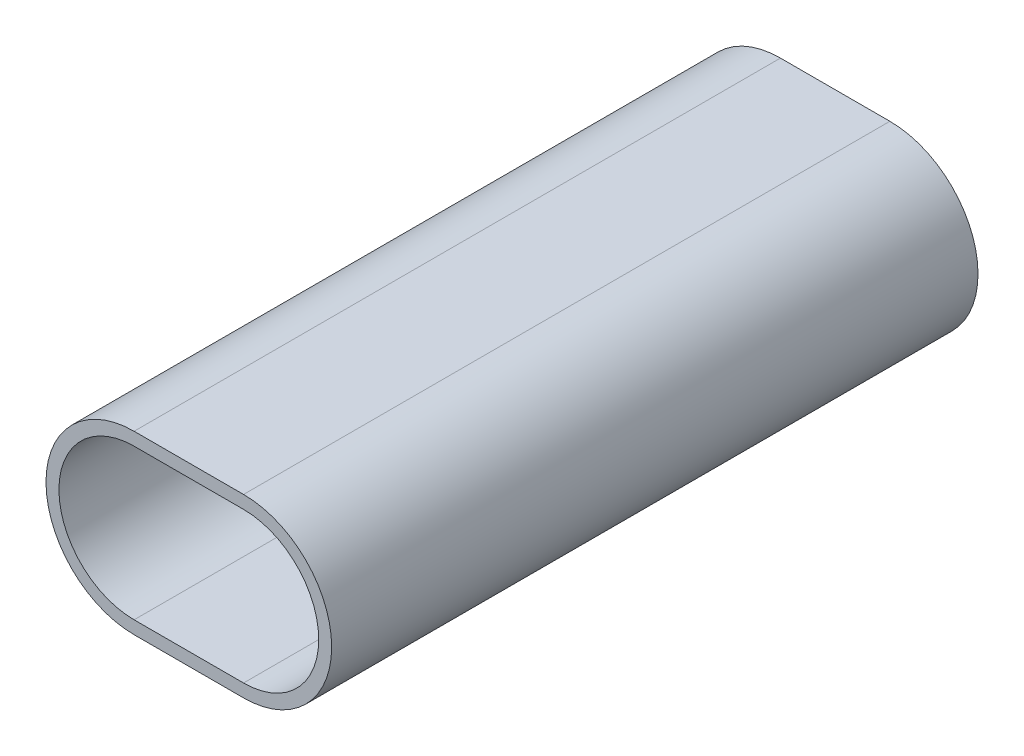
ISO-10303-21;
HEADER;
FILE_DESCRIPTION(('STEP AP214'),'2;1');
FILE_NAME('part.step','',(''),(''),'','','');
FILE_SCHEMA(('AUTOMOTIVE_DESIGN { 1 0 10303 214 1 1 1 1 }'));
ENDSEC;
DATA;
#1=APPLICATION_CONTEXT('core data for automotive mechanical design processes');
#2=APPLICATION_PROTOCOL_DEFINITION('international standard','automotive_design',2000,#1);
#3=PRODUCT_CONTEXT('',#1,'mechanical');
#4=PRODUCT('Part','Part','',(#3));
#5=PRODUCT_RELATED_PRODUCT_CATEGORY('part','',(#4));
#6=PRODUCT_DEFINITION_FORMATION('','',#4);
#7=PRODUCT_DEFINITION_CONTEXT('part definition',#1,'design');
#8=PRODUCT_DEFINITION('design','',#6,#7);
#9=PRODUCT_DEFINITION_SHAPE('','',#8);
#10=(LENGTH_UNIT() NAMED_UNIT(*) SI_UNIT(.MILLI.,.METRE.));
#11=(NAMED_UNIT(*) PLANE_ANGLE_UNIT() SI_UNIT($,.RADIAN.));
#12=(NAMED_UNIT(*) SI_UNIT($,.STERADIAN.) SOLID_ANGLE_UNIT());
#13=UNCERTAINTY_MEASURE_WITH_UNIT(LENGTH_MEASURE(1.E-05),#10,'distance_accuracy_value','');
#14=(GEOMETRIC_REPRESENTATION_CONTEXT(3) GLOBAL_UNCERTAINTY_ASSIGNED_CONTEXT((#13)) GLOBAL_UNIT_ASSIGNED_CONTEXT((#10,
#11,#12)) REPRESENTATION_CONTEXT('',''));
#15=CARTESIAN_POINT('',(0.,0.,0.));
#16=DIRECTION('',(0.,0.,1.));
#17=DIRECTION('',(1.,0.,0.));
#18=AXIS2_PLACEMENT_3D('',#15,#16,#17);
#19=CARTESIAN_POINT('',(-12.7,0.,75.));
#20=DIRECTION('',(0.,0.,1.));
#21=DIRECTION('',(1.,0.,0.));
#22=AXIS2_PLACEMENT_3D('',#19,#20,#21);
#23=PLANE('',#22);
#24=CARTESIAN_POINT('',(-12.7,0.,75.));
#25=DIRECTION('',(0.,0.,1.));
#26=DIRECTION('',(1.,0.,0.));
#27=AXIS2_PLACEMENT_3D('',#24,#25,#26);
#28=CIRCLE('',#27,20.447);
#29=CARTESIAN_POINT('',(-12.7,20.447,75.));
#30=VERTEX_POINT('',#29);
#31=CARTESIAN_POINT('',(-12.7,-20.447,75.));
#32=VERTEX_POINT('',#31);
#33=EDGE_CURVE('E159',#30,#32,#28,.T.);
#34=ORIENTED_EDGE('',*,*,#33,.T.);
#35=DIRECTION('',(1.,0.,0.));
#36=VECTOR('',#35,1.);
#37=CARTESIAN_POINT('',(-12.7,-20.447,75.));
#38=LINE('',#37,#36);
#39=CARTESIAN_POINT('',(12.7,-20.447,75.));
#40=VERTEX_POINT('',#39);
#41=EDGE_CURVE('E163',#32,#40,#38,.T.);
#42=ORIENTED_EDGE('',*,*,#41,.T.);
#43=CARTESIAN_POINT('',(12.7,0.,75.));
#44=DIRECTION('',(0.,0.,1.));
#45=DIRECTION('',(1.,0.,0.));
#46=AXIS2_PLACEMENT_3D('',#43,#44,#45);
#47=CIRCLE('',#46,20.447);
#48=CARTESIAN_POINT('',(12.7,20.447,75.));
#49=VERTEX_POINT('',#48);
#50=EDGE_CURVE('E167',#40,#49,#47,.T.);
#51=ORIENTED_EDGE('',*,*,#50,.T.);
#52=DIRECTION('',(-1.,0.,0.));
#53=VECTOR('',#52,1.);
#54=CARTESIAN_POINT('',(-12.7,20.447,75.));
#55=LINE('',#54,#53);
#56=EDGE_CURVE('E170',#49,#30,#55,.T.);
#57=ORIENTED_EDGE('',*,*,#56,.T.);
#58=EDGE_LOOP('',(#34,#42,#51,#57));
#59=FACE_BOUND('',#58,.T.);
#60=DIRECTION('',(1.,0.,0.));
#61=VECTOR('',#60,1.);
#62=CARTESIAN_POINT('',(-12.7,-17.447,75.));
#63=LINE('',#62,#61);
#64=CARTESIAN_POINT('',(-12.7,-17.447,75.));
#65=VERTEX_POINT('',#64);
#66=CARTESIAN_POINT('',(12.7,-17.447,75.));
#67=VERTEX_POINT('',#66);
#68=EDGE_CURVE('E120',#65,#67,#63,.T.);
#69=ORIENTED_EDGE('',*,*,#68,.F.);
#70=CARTESIAN_POINT('',(-12.7,0.,75.));
#71=DIRECTION('',(0.,0.,1.));
#72=DIRECTION('',(1.,0.,0.));
#73=AXIS2_PLACEMENT_3D('',#70,#71,#72);
#74=CIRCLE('',#73,17.447);
#75=CARTESIAN_POINT('',(-12.7,17.447,75.));
#76=VERTEX_POINT('',#75);
#77=EDGE_CURVE('E111',#76,#65,#74,.T.);
#78=ORIENTED_EDGE('',*,*,#77,.F.);
#79=DIRECTION('',(-1.,0.,0.));
#80=VECTOR('',#79,1.);
#81=CARTESIAN_POINT('',(-12.7,17.447,75.));
#82=LINE('',#81,#80);
#83=CARTESIAN_POINT('',(12.7,17.447,75.));
#84=VERTEX_POINT('',#83);
#85=EDGE_CURVE('E137',#84,#76,#82,.T.);
#86=ORIENTED_EDGE('',*,*,#85,.F.);
#87=CARTESIAN_POINT('',(12.7,0.,75.));
#88=DIRECTION('',(0.,0.,1.));
#89=DIRECTION('',(1.,0.,0.));
#90=AXIS2_PLACEMENT_3D('',#87,#88,#89);
#91=CIRCLE('',#90,17.447);
#92=EDGE_CURVE('E133',#67,#84,#91,.T.);
#93=ORIENTED_EDGE('',*,*,#92,.F.);
#94=EDGE_LOOP('',(#69,#78,#86,#93));
#95=FACE_BOUND('',#94,.T.);
#96=ADVANCED_FACE('F45',(#59,#95),#23,.T.);
#97=CARTESIAN_POINT('',(-12.7,0.,-75.));
#98=DIRECTION('',(0.,0.,1.));
#99=DIRECTION('',(1.,0.,0.));
#100=AXIS2_PLACEMENT_3D('',#97,#98,#99);
#101=PLANE('',#100);
#102=CARTESIAN_POINT('',(-12.7,0.,-75.));
#103=DIRECTION('',(0.,0.,1.));
#104=DIRECTION('',(1.,0.,0.));
#105=AXIS2_PLACEMENT_3D('',#102,#103,#104);
#106=CIRCLE('',#105,20.447);
#107=CARTESIAN_POINT('',(-12.7,20.447,-75.));
#108=VERTEX_POINT('',#107);
#109=CARTESIAN_POINT('',(-12.7,-20.447,-75.));
#110=VERTEX_POINT('',#109);
#111=EDGE_CURVE('E129',#108,#110,#106,.T.);
#112=ORIENTED_EDGE('',*,*,#111,.F.);
#113=DIRECTION('',(-1.,0.,0.));
#114=VECTOR('',#113,1.);
#115=CARTESIAN_POINT('',(-12.7,20.447,-75.));
#116=LINE('',#115,#114);
#117=CARTESIAN_POINT('',(12.7,20.447,-75.));
#118=VERTEX_POINT('',#117);
#119=EDGE_CURVE('E164',#118,#108,#116,.T.);
#120=ORIENTED_EDGE('',*,*,#119,.F.);
#121=CARTESIAN_POINT('',(12.7,0.,-75.));
#122=DIRECTION('',(0.,0.,1.));
#123=DIRECTION('',(1.,0.,0.));
#124=AXIS2_PLACEMENT_3D('',#121,#122,#123);
#125=CIRCLE('',#124,20.447);
#126=CARTESIAN_POINT('',(12.7,-20.447,-75.));
#127=VERTEX_POINT('',#126);
#128=EDGE_CURVE('E180',#127,#118,#125,.T.);
#129=ORIENTED_EDGE('',*,*,#128,.F.);
#130=DIRECTION('',(1.,0.,0.));
#131=VECTOR('',#130,1.);
#132=CARTESIAN_POINT('',(-12.7,-20.447,-75.));
#133=LINE('',#132,#131);
#134=EDGE_CURVE('E177',#110,#127,#133,.T.);
#135=ORIENTED_EDGE('',*,*,#134,.F.);
#136=EDGE_LOOP('',(#112,#120,#129,#135));
#137=FACE_BOUND('',#136,.T.);
#138=CARTESIAN_POINT('',(-12.7,0.,-75.));
#139=DIRECTION('',(0.,0.,1.));
#140=DIRECTION('',(1.,0.,0.));
#141=AXIS2_PLACEMENT_3D('',#138,#139,#140);
#142=CIRCLE('',#141,17.447);
#143=CARTESIAN_POINT('',(-12.7,17.447,-75.));
#144=VERTEX_POINT('',#143);
#145=CARTESIAN_POINT('',(-12.7,-17.447,-75.));
#146=VERTEX_POINT('',#145);
#147=EDGE_CURVE('E69',#144,#146,#142,.T.);
#148=ORIENTED_EDGE('',*,*,#147,.T.);
#149=DIRECTION('',(1.,0.,0.));
#150=VECTOR('',#149,1.);
#151=CARTESIAN_POINT('',(-12.7,-17.447,-75.));
#152=LINE('',#151,#150);
#153=CARTESIAN_POINT('',(12.7,-17.447,-75.));
#154=VERTEX_POINT('',#153);
#155=EDGE_CURVE('E127',#146,#154,#152,.T.);
#156=ORIENTED_EDGE('',*,*,#155,.T.);
#157=CARTESIAN_POINT('',(12.7,0.,-75.));
#158=DIRECTION('',(0.,0.,1.));
#159=DIRECTION('',(1.,0.,0.));
#160=AXIS2_PLACEMENT_3D('',#157,#158,#159);
#161=CIRCLE('',#160,17.447);
#162=CARTESIAN_POINT('',(12.7,17.447,-75.));
#163=VERTEX_POINT('',#162);
#164=EDGE_CURVE('E146',#154,#163,#161,.T.);
#165=ORIENTED_EDGE('',*,*,#164,.T.);
#166=DIRECTION('',(-1.,0.,0.));
#167=VECTOR('',#166,1.);
#168=CARTESIAN_POINT('',(-12.7,17.447,-75.));
#169=LINE('',#168,#167);
#170=EDGE_CURVE('E121',#163,#144,#169,.T.);
#171=ORIENTED_EDGE('',*,*,#170,.T.);
#172=EDGE_LOOP('',(#148,#156,#165,#171));
#173=FACE_BOUND('',#172,.T.);
#174=ADVANCED_FACE('F203',(#137,#173),#101,.F.);
#175=CARTESIAN_POINT('',(-12.7,0.,75.));
#176=DIRECTION('',(0.,0.,-1.));
#177=DIRECTION('',(-1.,0.,0.));
#178=AXIS2_PLACEMENT_3D('',#175,#176,#177);
#179=CYLINDRICAL_SURFACE('',#178,20.447);
#180=ORIENTED_EDGE('',*,*,#111,.T.);
#181=DIRECTION('',(0.,0.,-1.));
#182=VECTOR('',#181,1.);
#183=CARTESIAN_POINT('',(-12.7,-20.447,75.));
#184=LINE('',#183,#182);
#185=EDGE_CURVE('E11',#32,#110,#184,.T.);
#186=ORIENTED_EDGE('',*,*,#185,.F.);
#187=ORIENTED_EDGE('',*,*,#33,.F.);
#188=DIRECTION('',(0.,0.,-1.));
#189=VECTOR('',#188,1.);
#190=CARTESIAN_POINT('',(-12.7,20.447,75.));
#191=LINE('',#190,#189);
#192=EDGE_CURVE('E173',#30,#108,#191,.T.);
#193=ORIENTED_EDGE('',*,*,#192,.T.);
#194=EDGE_LOOP('',(#180,#186,#187,#193));
#195=FACE_BOUND('',#194,.T.);
#196=ADVANCED_FACE('F47',(#195),#179,.T.);
#197=CARTESIAN_POINT('',(-12.7,-20.447,75.));
#198=DIRECTION('',(0.,1.,0.));
#199=DIRECTION('',(-1.,0.,0.));
#200=AXIS2_PLACEMENT_3D('',#197,#198,#199);
#201=PLANE('',#200);
#202=ORIENTED_EDGE('',*,*,#134,.T.);
#203=DIRECTION('',(0.,0.,-1.));
#204=VECTOR('',#203,1.);
#205=CARTESIAN_POINT('',(12.7,-20.447,75.));
#206=LINE('',#205,#204);
#207=EDGE_CURVE('E54',#40,#127,#206,.T.);
#208=ORIENTED_EDGE('',*,*,#207,.F.);
#209=ORIENTED_EDGE('',*,*,#41,.F.);
#210=ORIENTED_EDGE('',*,*,#185,.T.);
#211=EDGE_LOOP('',(#202,#208,#209,#210));
#212=FACE_BOUND('',#211,.T.);
#213=ADVANCED_FACE('F213',(#212),#201,.F.);
#214=CARTESIAN_POINT('',(12.7,0.,75.));
#215=DIRECTION('',(0.,0.,-1.));
#216=DIRECTION('',(-1.,0.,0.));
#217=AXIS2_PLACEMENT_3D('',#214,#215,#216);
#218=CYLINDRICAL_SURFACE('',#217,20.447);
#219=ORIENTED_EDGE('',*,*,#128,.T.);
#220=DIRECTION('',(0.,0.,-1.));
#221=VECTOR('',#220,1.);
#222=CARTESIAN_POINT('',(12.7,20.447,75.));
#223=LINE('',#222,#221);
#224=EDGE_CURVE('E188',#49,#118,#223,.T.);
#225=ORIENTED_EDGE('',*,*,#224,.F.);
#226=ORIENTED_EDGE('',*,*,#50,.F.);
#227=ORIENTED_EDGE('',*,*,#207,.T.);
#228=EDGE_LOOP('',(#219,#225,#226,#227));
#229=FACE_BOUND('',#228,.T.);
#230=ADVANCED_FACE('F197',(#229),#218,.T.);
#231=CARTESIAN_POINT('',(-12.7,20.447,75.));
#232=DIRECTION('',(0.,-1.,0.));
#233=DIRECTION('',(1.,0.,0.));
#234=AXIS2_PLACEMENT_3D('',#231,#232,#233);
#235=PLANE('',#234);
#236=ORIENTED_EDGE('',*,*,#119,.T.);
#237=ORIENTED_EDGE('',*,*,#192,.F.);
#238=ORIENTED_EDGE('',*,*,#56,.F.);
#239=ORIENTED_EDGE('',*,*,#224,.T.);
#240=EDGE_LOOP('',(#236,#237,#238,#239));
#241=FACE_BOUND('',#240,.T.);
#242=ADVANCED_FACE('F207',(#241),#235,.F.);
#243=CARTESIAN_POINT('',(-12.7,0.,75.));
#244=DIRECTION('',(0.,0.,-1.));
#245=DIRECTION('',(-1.,0.,0.));
#246=AXIS2_PLACEMENT_3D('',#243,#244,#245);
#247=CYLINDRICAL_SURFACE('',#246,17.447);
#248=ORIENTED_EDGE('',*,*,#147,.F.);
#249=DIRECTION('',(0.,0.,-1.));
#250=VECTOR('',#249,1.);
#251=CARTESIAN_POINT('',(-12.7,17.447,75.));
#252=LINE('',#251,#250);
#253=EDGE_CURVE('E115',#76,#144,#252,.T.);
#254=ORIENTED_EDGE('',*,*,#253,.F.);
#255=ORIENTED_EDGE('',*,*,#77,.T.);
#256=DIRECTION('',(0.,0.,-1.));
#257=VECTOR('',#256,1.);
#258=CARTESIAN_POINT('',(-12.7,-17.447,75.));
#259=LINE('',#258,#257);
#260=EDGE_CURVE('E114',#65,#146,#259,.T.);
#261=ORIENTED_EDGE('',*,*,#260,.T.);
#262=EDGE_LOOP('',(#248,#254,#255,#261));
#263=FACE_BOUND('',#262,.T.);
#264=ADVANCED_FACE('F113',(#263),#247,.F.);
#265=CARTESIAN_POINT('',(-12.7,-17.447,75.));
#266=DIRECTION('',(0.,1.,0.));
#267=DIRECTION('',(-1.,0.,0.));
#268=AXIS2_PLACEMENT_3D('',#265,#266,#267);
#269=PLANE('',#268);
#270=ORIENTED_EDGE('',*,*,#155,.F.);
#271=ORIENTED_EDGE('',*,*,#260,.F.);
#272=ORIENTED_EDGE('',*,*,#68,.T.);
#273=DIRECTION('',(0.,0.,-1.));
#274=VECTOR('',#273,1.);
#275=CARTESIAN_POINT('',(12.7,-17.447,75.));
#276=LINE('',#275,#274);
#277=EDGE_CURVE('E130',#67,#154,#276,.T.);
#278=ORIENTED_EDGE('',*,*,#277,.T.);
#279=EDGE_LOOP('',(#270,#271,#272,#278));
#280=FACE_BOUND('',#279,.T.);
#281=ADVANCED_FACE('F124',(#280),#269,.T.);
#282=CARTESIAN_POINT('',(12.7,0.,75.));
#283=DIRECTION('',(0.,0.,-1.));
#284=DIRECTION('',(-1.,0.,0.));
#285=AXIS2_PLACEMENT_3D('',#282,#283,#284);
#286=CYLINDRICAL_SURFACE('',#285,17.447);
#287=ORIENTED_EDGE('',*,*,#164,.F.);
#288=ORIENTED_EDGE('',*,*,#277,.F.);
#289=ORIENTED_EDGE('',*,*,#92,.T.);
#290=DIRECTION('',(0.,0.,-1.));
#291=VECTOR('',#290,1.);
#292=CARTESIAN_POINT('',(12.7,17.447,75.));
#293=LINE('',#292,#291);
#294=EDGE_CURVE('E61',#84,#163,#293,.T.);
#295=ORIENTED_EDGE('',*,*,#294,.T.);
#296=EDGE_LOOP('',(#287,#288,#289,#295));
#297=FACE_BOUND('',#296,.T.);
#298=ADVANCED_FACE('F236',(#297),#286,.F.);
#299=CARTESIAN_POINT('',(-12.7,17.447,75.));
#300=DIRECTION('',(0.,-1.,0.));
#301=DIRECTION('',(0.,0.,-1.));
#302=AXIS2_PLACEMENT_3D('',#299,#300,#301);
#303=PLANE('',#302);
#304=ORIENTED_EDGE('',*,*,#170,.F.);
#305=ORIENTED_EDGE('',*,*,#294,.F.);
#306=ORIENTED_EDGE('',*,*,#85,.T.);
#307=ORIENTED_EDGE('',*,*,#253,.T.);
#308=EDGE_LOOP('',(#304,#305,#306,#307));
#309=FACE_BOUND('',#308,.T.);
#310=ADVANCED_FACE('F240',(#309),#303,.T.);
#311=CLOSED_SHELL('',(#96,#174,#196,#213,#230,#242,#264,#281,#298,#310));
#312=MANIFOLD_SOLID_BREP('B2',#311);
#313=ADVANCED_BREP_SHAPE_REPRESENTATION('',(#18,#312),#14);
#314=SHAPE_DEFINITION_REPRESENTATION(#9,#313);
ENDSEC;
END-ISO-10303-21;
